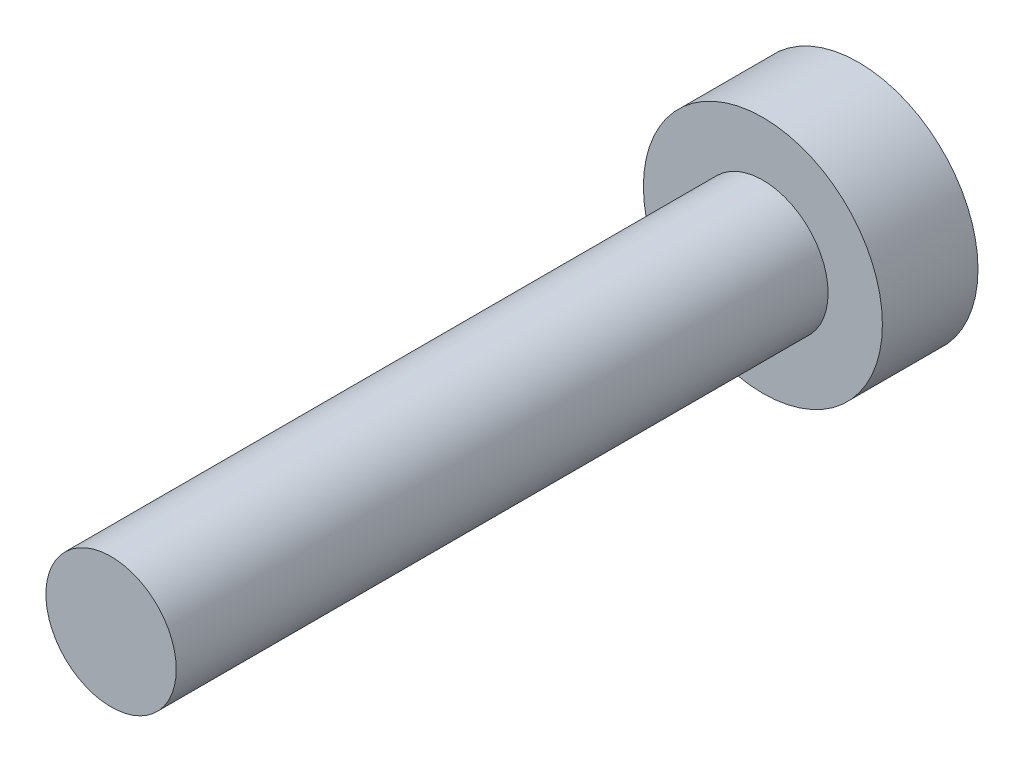
ISO-10303-21;
HEADER;
FILE_DESCRIPTION(('STEP AP214'),'2;1');
FILE_NAME('part.step','',(''),(''),'','','');
FILE_SCHEMA(('AUTOMOTIVE_DESIGN { 1 0 10303 214 1 1 1 1 }'));
ENDSEC;
DATA;
#1=APPLICATION_CONTEXT('core data for automotive mechanical design processes');
#2=APPLICATION_PROTOCOL_DEFINITION('international standard','automotive_design',2000,#1);
#3=PRODUCT_CONTEXT('',#1,'mechanical');
#4=PRODUCT('Part','Part','',(#3));
#5=PRODUCT_RELATED_PRODUCT_CATEGORY('part','',(#4));
#6=PRODUCT_DEFINITION_FORMATION('','',#4);
#7=PRODUCT_DEFINITION_CONTEXT('part definition',#1,'design');
#8=PRODUCT_DEFINITION('design','',#6,#7);
#9=PRODUCT_DEFINITION_SHAPE('','',#8);
#10=(LENGTH_UNIT() NAMED_UNIT(*) SI_UNIT(.MILLI.,.METRE.));
#11=(NAMED_UNIT(*) PLANE_ANGLE_UNIT() SI_UNIT($,.RADIAN.));
#12=(NAMED_UNIT(*) SI_UNIT($,.STERADIAN.) SOLID_ANGLE_UNIT());
#13=UNCERTAINTY_MEASURE_WITH_UNIT(LENGTH_MEASURE(1.E-05),#10,'distance_accuracy_value','');
#14=(GEOMETRIC_REPRESENTATION_CONTEXT(3) GLOBAL_UNCERTAINTY_ASSIGNED_CONTEXT((#13)) GLOBAL_UNIT_ASSIGNED_CONTEXT((#10,
#11,#12)) REPRESENTATION_CONTEXT('',''));
#15=CARTESIAN_POINT('',(0.,0.,0.));
#16=DIRECTION('',(0.,0.,1.));
#17=DIRECTION('',(1.,0.,0.));
#18=AXIS2_PLACEMENT_3D('',#15,#16,#17);
#19=CARTESIAN_POINT('',(0.,0.,2.2));
#20=DIRECTION('',(0.,0.,-1.));
#21=DIRECTION('',(-1.,0.,0.));
#22=AXIS2_PLACEMENT_3D('',#19,#20,#21);
#23=CYLINDRICAL_SURFACE('',#22,2.75);
#24=CARTESIAN_POINT('',(0.,0.,2.2));
#25=DIRECTION('',(0.,0.,1.));
#26=DIRECTION('',(1.,0.,0.));
#27=AXIS2_PLACEMENT_3D('',#24,#25,#26);
#28=CIRCLE('',#27,2.75);
#29=CARTESIAN_POINT('',(2.75,0.,2.2));
#30=VERTEX_POINT('',#29);
#31=EDGE_CURVE('E39',#30,#30,#28,.T.);
#32=ORIENTED_EDGE('',*,*,#31,.F.);
#33=EDGE_LOOP('',(#32));
#34=FACE_BOUND('',#33,.T.);
#35=CARTESIAN_POINT('',(0.,0.,0.));
#36=DIRECTION('',(0.,0.,1.));
#37=DIRECTION('',(1.,0.,0.));
#38=AXIS2_PLACEMENT_3D('',#35,#36,#37);
#39=CIRCLE('',#38,2.75);
#40=CARTESIAN_POINT('',(2.75,0.,0.));
#41=VERTEX_POINT('',#40);
#42=EDGE_CURVE('E35',#41,#41,#39,.T.);
#43=ORIENTED_EDGE('',*,*,#42,.T.);
#44=EDGE_LOOP('',(#43));
#45=FACE_BOUND('',#44,.T.);
#46=ADVANCED_FACE('F32',(#34,#45),#23,.T.);
#47=CARTESIAN_POINT('',(0.,0.,2.2));
#48=DIRECTION('',(0.,0.,1.));
#49=DIRECTION('',(1.,0.,0.));
#50=AXIS2_PLACEMENT_3D('',#47,#48,#49);
#51=PLANE('',#50);
#52=CARTESIAN_POINT('',(0.,0.,2.2));
#53=DIRECTION('',(0.,0.,1.));
#54=DIRECTION('',(1.,0.,0.));
#55=AXIS2_PLACEMENT_3D('',#52,#53,#54);
#56=CIRCLE('',#55,1.5);
#57=CARTESIAN_POINT('',(1.5,0.,2.2));
#58=VERTEX_POINT('',#57);
#59=EDGE_CURVE('E10',#58,#58,#56,.T.);
#60=ORIENTED_EDGE('',*,*,#59,.F.);
#61=EDGE_LOOP('',(#60));
#62=FACE_BOUND('',#61,.T.);
#63=ORIENTED_EDGE('',*,*,#31,.T.);
#64=EDGE_LOOP('',(#63));
#65=FACE_BOUND('',#64,.T.);
#66=ADVANCED_FACE('F56',(#62,#65),#51,.T.);
#67=CARTESIAN_POINT('',(0.,0.,0.));
#68=DIRECTION('',(0.,0.,1.));
#69=DIRECTION('',(1.,0.,0.));
#70=AXIS2_PLACEMENT_3D('',#67,#68,#69);
#71=PLANE('',#70);
#72=ORIENTED_EDGE('',*,*,#42,.F.);
#73=EDGE_LOOP('',(#72));
#74=FACE_BOUND('',#73,.T.);
#75=ADVANCED_FACE('F53',(#74),#71,.F.);
#76=CARTESIAN_POINT('',(0.,0.,17.2));
#77=DIRECTION('',(0.,0.,-1.));
#78=DIRECTION('',(-1.,0.,0.));
#79=AXIS2_PLACEMENT_3D('',#76,#77,#78);
#80=CYLINDRICAL_SURFACE('',#79,1.5);
#81=CARTESIAN_POINT('',(0.,0.,17.2));
#82=DIRECTION('',(0.,0.,1.));
#83=DIRECTION('',(1.,0.,0.));
#84=AXIS2_PLACEMENT_3D('',#81,#82,#83);
#85=CIRCLE('',#84,1.5);
#86=CARTESIAN_POINT('',(1.5,0.,17.2));
#87=VERTEX_POINT('',#86);
#88=EDGE_CURVE('E45',#87,#87,#85,.T.);
#89=ORIENTED_EDGE('',*,*,#88,.F.);
#90=EDGE_LOOP('',(#89));
#91=FACE_BOUND('',#90,.T.);
#92=ORIENTED_EDGE('',*,*,#59,.T.);
#93=EDGE_LOOP('',(#92));
#94=FACE_BOUND('',#93,.T.);
#95=ADVANCED_FACE('F55',(#91,#94),#80,.T.);
#96=CARTESIAN_POINT('',(0.,0.,17.2));
#97=DIRECTION('',(0.,0.,1.));
#98=DIRECTION('',(1.,0.,0.));
#99=AXIS2_PLACEMENT_3D('',#96,#97,#98);
#100=PLANE('',#99);
#101=ORIENTED_EDGE('',*,*,#88,.T.);
#102=EDGE_LOOP('',(#101));
#103=FACE_BOUND('',#102,.T.);
#104=ADVANCED_FACE('F61',(#103),#100,.T.);
#105=CLOSED_SHELL('',(#46,#66,#75,#95,#104));
#106=MANIFOLD_SOLID_BREP('B2',#105);
#107=ADVANCED_BREP_SHAPE_REPRESENTATION('',(#18,#106),#14);
#108=SHAPE_DEFINITION_REPRESENTATION(#9,#107);
ENDSEC;
END-ISO-10303-21;
